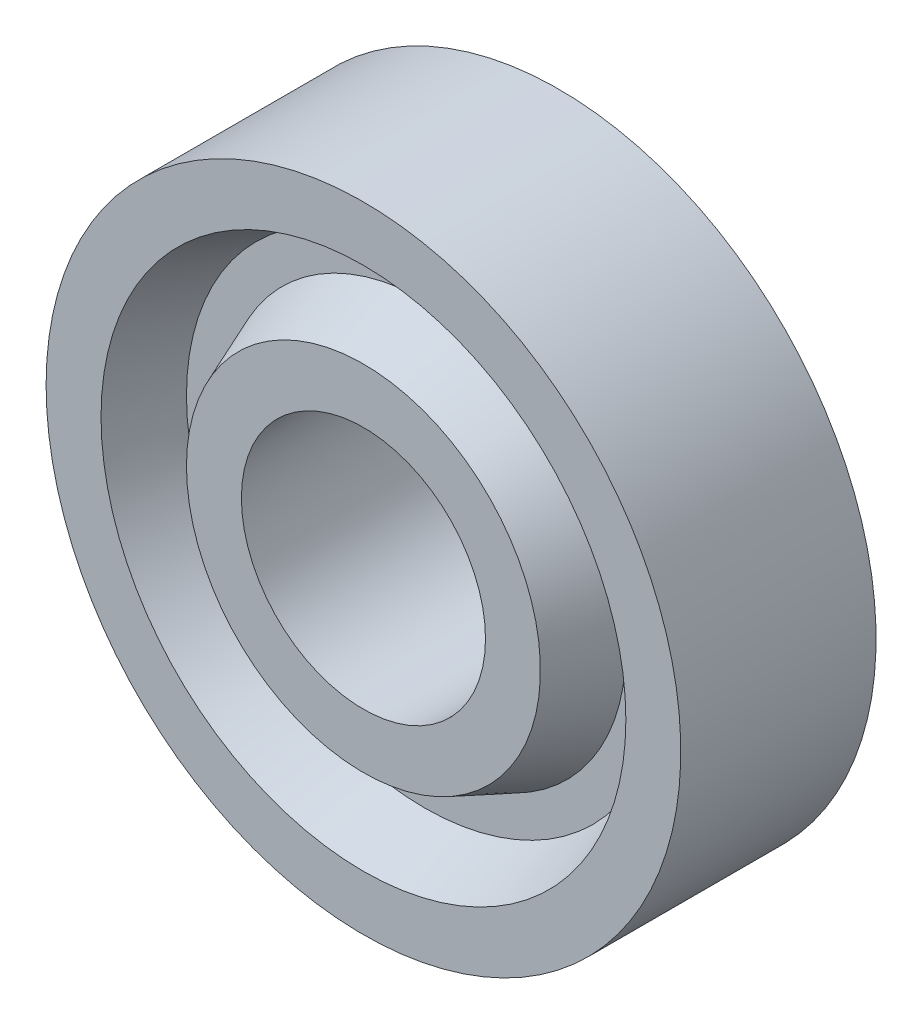
ISO-10303-21;
HEADER;
FILE_DESCRIPTION(('STEP AP214'),'2;1');
FILE_NAME('part.step','',(''),(''),'','','');
FILE_SCHEMA(('AUTOMOTIVE_DESIGN { 1 0 10303 214 1 1 1 1 }'));
ENDSEC;
DATA;
#1=APPLICATION_CONTEXT('core data for automotive mechanical design processes');
#2=APPLICATION_PROTOCOL_DEFINITION('international standard','automotive_design',2000,#1);
#3=PRODUCT_CONTEXT('',#1,'mechanical');
#4=PRODUCT('Part','Part','',(#3));
#5=PRODUCT_RELATED_PRODUCT_CATEGORY('part','',(#4));
#6=PRODUCT_DEFINITION_FORMATION('','',#4);
#7=PRODUCT_DEFINITION_CONTEXT('part definition',#1,'design');
#8=PRODUCT_DEFINITION('design','',#6,#7);
#9=PRODUCT_DEFINITION_SHAPE('','',#8);
#10=(LENGTH_UNIT() NAMED_UNIT(*) SI_UNIT(.MILLI.,.METRE.));
#11=(NAMED_UNIT(*) PLANE_ANGLE_UNIT() SI_UNIT($,.RADIAN.));
#12=(NAMED_UNIT(*) SI_UNIT($,.STERADIAN.) SOLID_ANGLE_UNIT());
#13=UNCERTAINTY_MEASURE_WITH_UNIT(LENGTH_MEASURE(1.E-05),#10,'distance_accuracy_value','');
#14=(GEOMETRIC_REPRESENTATION_CONTEXT(3) GLOBAL_UNCERTAINTY_ASSIGNED_CONTEXT((#13)) GLOBAL_UNIT_ASSIGNED_CONTEXT((#10,
#11,#12)) REPRESENTATION_CONTEXT('',''));
#15=CARTESIAN_POINT('',(0.,0.,0.));
#16=DIRECTION('',(0.,0.,1.));
#17=DIRECTION('',(1.,0.,0.));
#18=AXIS2_PLACEMENT_3D('',#15,#16,#17);
#19=CARTESIAN_POINT('',(5.,0.,-4.));
#20=DIRECTION('',(0.,0.,1.));
#21=DIRECTION('',(1.,0.,0.));
#22=AXIS2_PLACEMENT_3D('',#19,#20,#21);
#23=PLANE('',#22);
#24=CARTESIAN_POINT('',(0.,0.,-4.));
#25=DIRECTION('',(0.,0.,-1.));
#26=DIRECTION('',(-1.,0.,0.));
#27=AXIS2_PLACEMENT_3D('',#24,#25,#26);
#28=CIRCLE('',#27,5.);
#29=CARTESIAN_POINT('',(-4.99999999999999,0.,-4.));
#30=VERTEX_POINT('',#29);
#31=EDGE_CURVE('E73',#30,#30,#28,.T.);
#32=ORIENTED_EDGE('',*,*,#31,.F.);
#33=EDGE_LOOP('',(#32));
#34=FACE_BOUND('',#33,.T.);
#35=CARTESIAN_POINT('',(0.,0.,-4.));
#36=DIRECTION('',(0.,0.,-1.));
#37=DIRECTION('',(-1.,0.,0.));
#38=AXIS2_PLACEMENT_3D('',#35,#36,#37);
#39=CIRCLE('',#38,7.25);
#40=CARTESIAN_POINT('',(-7.24999999999999,0.,-4.));
#41=VERTEX_POINT('',#40);
#42=EDGE_CURVE('E10',#41,#41,#39,.T.);
#43=ORIENTED_EDGE('',*,*,#42,.T.);
#44=EDGE_LOOP('',(#43));
#45=FACE_BOUND('',#44,.T.);
#46=ADVANCED_FACE('F33',(#34,#45),#23,.F.);
#47=CARTESIAN_POINT('',(0.,0.,-1.5));
#48=DIRECTION('',(0.,0.,1.));
#49=DIRECTION('',(1.,0.,0.));
#50=AXIS2_PLACEMENT_3D('',#47,#48,#49);
#51=CONICAL_SURFACE('',#50,8.25,0.380506377112365);
#52=ORIENTED_EDGE('',*,*,#42,.F.);
#53=EDGE_LOOP('',(#52));
#54=FACE_BOUND('',#53,.T.);
#55=CARTESIAN_POINT('',(0.,0.,-1.5));
#56=DIRECTION('',(0.,0.,-1.));
#57=DIRECTION('',(-1.,0.,0.));
#58=AXIS2_PLACEMENT_3D('',#55,#56,#57);
#59=CIRCLE('',#58,8.25);
#60=CARTESIAN_POINT('',(-8.24999999999999,0.,-1.5));
#61=VERTEX_POINT('',#60);
#62=EDGE_CURVE('E39',#61,#61,#59,.T.);
#63=ORIENTED_EDGE('',*,*,#62,.T.);
#64=EDGE_LOOP('',(#63));
#65=FACE_BOUND('',#64,.T.);
#66=ADVANCED_FACE('F80',(#54,#65),#51,.T.);
#67=CARTESIAN_POINT('',(8.25,0.,-1.5));
#68=DIRECTION('',(0.,0.,1.));
#69=DIRECTION('',(1.,0.,0.));
#70=AXIS2_PLACEMENT_3D('',#67,#68,#69);
#71=PLANE('',#70);
#72=ORIENTED_EDGE('',*,*,#62,.F.);
#73=EDGE_LOOP('',(#72));
#74=FACE_BOUND('',#73,.T.);
#75=CARTESIAN_POINT('',(0.,0.,-1.5));
#76=DIRECTION('',(0.,0.,-1.));
#77=DIRECTION('',(-1.,0.,0.));
#78=AXIS2_PLACEMENT_3D('',#75,#76,#77);
#79=CIRCLE('',#78,9.75);
#80=CARTESIAN_POINT('',(-9.74999999999999,0.,-1.5));
#81=VERTEX_POINT('',#80);
#82=EDGE_CURVE('E43',#81,#81,#79,.T.);
#83=ORIENTED_EDGE('',*,*,#82,.T.);
#84=EDGE_LOOP('',(#83));
#85=FACE_BOUND('',#84,.T.);
#86=ADVANCED_FACE('F84',(#74,#85),#71,.F.);
#87=CARTESIAN_POINT('',(0.,0.,-4.));
#88=DIRECTION('',(0.,0.,-1.));
#89=DIRECTION('',(-1.,0.,0.));
#90=AXIS2_PLACEMENT_3D('',#87,#88,#89);
#91=CONICAL_SURFACE('',#90,10.75,0.380506377112365);
#92=ORIENTED_EDGE('',*,*,#82,.F.);
#93=EDGE_LOOP('',(#92));
#94=FACE_BOUND('',#93,.T.);
#95=CARTESIAN_POINT('',(0.,0.,-4.));
#96=DIRECTION('',(0.,0.,-1.));
#97=DIRECTION('',(-1.,0.,0.));
#98=AXIS2_PLACEMENT_3D('',#95,#96,#97);
#99=CIRCLE('',#98,10.75);
#100=CARTESIAN_POINT('',(-10.75,0.,-4.));
#101=VERTEX_POINT('',#100);
#102=EDGE_CURVE('E47',#101,#101,#99,.T.);
#103=ORIENTED_EDGE('',*,*,#102,.T.);
#104=EDGE_LOOP('',(#103));
#105=FACE_BOUND('',#104,.T.);
#106=ADVANCED_FACE('F89',(#94,#105),#91,.F.);
#107=CARTESIAN_POINT('',(10.75,0.,-4.));
#108=DIRECTION('',(0.,0.,1.));
#109=DIRECTION('',(1.,0.,0.));
#110=AXIS2_PLACEMENT_3D('',#107,#108,#109);
#111=PLANE('',#110);
#112=ORIENTED_EDGE('',*,*,#102,.F.);
#113=EDGE_LOOP('',(#112));
#114=FACE_BOUND('',#113,.T.);
#115=CARTESIAN_POINT('',(0.,0.,-4.));
#116=DIRECTION('',(0.,0.,-1.));
#117=DIRECTION('',(-1.,0.,0.));
#118=AXIS2_PLACEMENT_3D('',#115,#116,#117);
#119=CIRCLE('',#118,13.);
#120=CARTESIAN_POINT('',(-13.,0.,-3.99999999999999));
#121=VERTEX_POINT('',#120);
#122=EDGE_CURVE('E52',#121,#121,#119,.T.);
#123=ORIENTED_EDGE('',*,*,#122,.T.);
#124=EDGE_LOOP('',(#123));
#125=FACE_BOUND('',#124,.T.);
#126=ADVANCED_FACE('F95',(#114,#125),#111,.F.);
#127=CARTESIAN_POINT('',(0.,0.,-28.9111066531376));
#128=DIRECTION('',(0.,0.,-1.));
#129=DIRECTION('',(-1.,0.,0.));
#130=AXIS2_PLACEMENT_3D('',#127,#128,#129);
#131=CYLINDRICAL_SURFACE('',#130,13.);
#132=ORIENTED_EDGE('',*,*,#122,.F.);
#133=EDGE_LOOP('',(#132));
#134=FACE_BOUND('',#133,.T.);
#135=CARTESIAN_POINT('',(0.,0.,4.));
#136=DIRECTION('',(0.,0.,-1.));
#137=DIRECTION('',(-1.,0.,0.));
#138=AXIS2_PLACEMENT_3D('',#135,#136,#137);
#139=CIRCLE('',#138,13.);
#140=CARTESIAN_POINT('',(-13.,0.,4.00000000000001));
#141=VERTEX_POINT('',#140);
#142=EDGE_CURVE('E55',#141,#141,#139,.T.);
#143=ORIENTED_EDGE('',*,*,#142,.T.);
#144=EDGE_LOOP('',(#143));
#145=FACE_BOUND('',#144,.T.);
#146=ADVANCED_FACE('F99',(#134,#145),#131,.T.);
#147=CARTESIAN_POINT('',(10.75,0.,4.));
#148=DIRECTION('',(0.,0.,-1.));
#149=DIRECTION('',(-1.,0.,0.));
#150=AXIS2_PLACEMENT_3D('',#147,#148,#149);
#151=PLANE('',#150);
#152=ORIENTED_EDGE('',*,*,#142,.F.);
#153=EDGE_LOOP('',(#152));
#154=FACE_BOUND('',#153,.T.);
#155=CARTESIAN_POINT('',(0.,0.,4.));
#156=DIRECTION('',(0.,0.,-1.));
#157=DIRECTION('',(-1.,0.,0.));
#158=AXIS2_PLACEMENT_3D('',#155,#156,#157);
#159=CIRCLE('',#158,10.75);
#160=CARTESIAN_POINT('',(-10.75,0.,4.00000000000001));
#161=VERTEX_POINT('',#160);
#162=EDGE_CURVE('E58',#161,#161,#159,.T.);
#163=ORIENTED_EDGE('',*,*,#162,.T.);
#164=EDGE_LOOP('',(#163));
#165=FACE_BOUND('',#164,.T.);
#166=ADVANCED_FACE('F103',(#154,#165),#151,.F.);
#167=CARTESIAN_POINT('',(0.,0.,1.5));
#168=DIRECTION('',(0.,0.,1.));
#169=DIRECTION('',(1.,0.,0.));
#170=AXIS2_PLACEMENT_3D('',#167,#168,#169);
#171=CONICAL_SURFACE('',#170,9.75,0.380506377112364);
#172=ORIENTED_EDGE('',*,*,#162,.F.);
#173=EDGE_LOOP('',(#172));
#174=FACE_BOUND('',#173,.T.);
#175=CARTESIAN_POINT('',(0.,0.,1.5));
#176=DIRECTION('',(0.,0.,-1.));
#177=DIRECTION('',(-1.,0.,0.));
#178=AXIS2_PLACEMENT_3D('',#175,#176,#177);
#179=CIRCLE('',#178,9.75);
#180=CARTESIAN_POINT('',(-9.74999999999999,0.,1.5));
#181=VERTEX_POINT('',#180);
#182=EDGE_CURVE('E61',#181,#181,#179,.T.);
#183=ORIENTED_EDGE('',*,*,#182,.T.);
#184=EDGE_LOOP('',(#183));
#185=FACE_BOUND('',#184,.T.);
#186=ADVANCED_FACE('F107',(#174,#185),#171,.F.);
#187=CARTESIAN_POINT('',(9.75,0.,1.5));
#188=DIRECTION('',(0.,0.,-1.));
#189=DIRECTION('',(-1.,0.,0.));
#190=AXIS2_PLACEMENT_3D('',#187,#188,#189);
#191=PLANE('',#190);
#192=ORIENTED_EDGE('',*,*,#182,.F.);
#193=EDGE_LOOP('',(#192));
#194=FACE_BOUND('',#193,.T.);
#195=CARTESIAN_POINT('',(0.,0.,1.5));
#196=DIRECTION('',(0.,0.,-1.));
#197=DIRECTION('',(-1.,0.,0.));
#198=AXIS2_PLACEMENT_3D('',#195,#196,#197);
#199=CIRCLE('',#198,8.25);
#200=CARTESIAN_POINT('',(-8.24999999999999,0.,1.5));
#201=VERTEX_POINT('',#200);
#202=EDGE_CURVE('E64',#201,#201,#199,.T.);
#203=ORIENTED_EDGE('',*,*,#202,.T.);
#204=EDGE_LOOP('',(#203));
#205=FACE_BOUND('',#204,.T.);
#206=ADVANCED_FACE('F111',(#194,#205),#191,.F.);
#207=CARTESIAN_POINT('',(0.,0.,4.));
#208=DIRECTION('',(0.,0.,-1.));
#209=DIRECTION('',(-1.,0.,0.));
#210=AXIS2_PLACEMENT_3D('',#207,#208,#209);
#211=CONICAL_SURFACE('',#210,7.25,0.380506377112365);
#212=ORIENTED_EDGE('',*,*,#202,.F.);
#213=EDGE_LOOP('',(#212));
#214=FACE_BOUND('',#213,.T.);
#215=CARTESIAN_POINT('',(0.,0.,4.));
#216=DIRECTION('',(0.,0.,-1.));
#217=DIRECTION('',(-1.,0.,0.));
#218=AXIS2_PLACEMENT_3D('',#215,#216,#217);
#219=CIRCLE('',#218,7.25);
#220=CARTESIAN_POINT('',(-7.24999999999999,0.,4.));
#221=VERTEX_POINT('',#220);
#222=EDGE_CURVE('E67',#221,#221,#219,.T.);
#223=ORIENTED_EDGE('',*,*,#222,.T.);
#224=EDGE_LOOP('',(#223));
#225=FACE_BOUND('',#224,.T.);
#226=ADVANCED_FACE('F115',(#214,#225),#211,.T.);
#227=CARTESIAN_POINT('',(5.,0.,4.));
#228=DIRECTION('',(0.,0.,-1.));
#229=DIRECTION('',(-1.,0.,0.));
#230=AXIS2_PLACEMENT_3D('',#227,#228,#229);
#231=PLANE('',#230);
#232=ORIENTED_EDGE('',*,*,#222,.F.);
#233=EDGE_LOOP('',(#232));
#234=FACE_BOUND('',#233,.T.);
#235=CARTESIAN_POINT('',(0.,0.,4.));
#236=DIRECTION('',(0.,0.,-1.));
#237=DIRECTION('',(-1.,0.,0.));
#238=AXIS2_PLACEMENT_3D('',#235,#236,#237);
#239=CIRCLE('',#238,5.);
#240=CARTESIAN_POINT('',(-4.99999999999999,0.,4.));
#241=VERTEX_POINT('',#240);
#242=EDGE_CURVE('E70',#241,#241,#239,.T.);
#243=ORIENTED_EDGE('',*,*,#242,.T.);
#244=EDGE_LOOP('',(#243));
#245=FACE_BOUND('',#244,.T.);
#246=ADVANCED_FACE('F119',(#234,#245),#231,.F.);
#247=CARTESIAN_POINT('',(0.,0.,-28.9111066531376));
#248=DIRECTION('',(0.,0.,-1.));
#249=DIRECTION('',(-1.,0.,0.));
#250=AXIS2_PLACEMENT_3D('',#247,#248,#249);
#251=CYLINDRICAL_SURFACE('',#250,5.);
#252=ORIENTED_EDGE('',*,*,#242,.F.);
#253=EDGE_LOOP('',(#252));
#254=FACE_BOUND('',#253,.T.);
#255=ORIENTED_EDGE('',*,*,#31,.T.);
#256=EDGE_LOOP('',(#255));
#257=FACE_BOUND('',#256,.T.);
#258=ADVANCED_FACE('F77',(#254,#257),#251,.F.);
#259=CLOSED_SHELL('',(#46,#66,#86,#106,#126,#146,#166,#186,#206,#226,#246,#258));
#260=MANIFOLD_SOLID_BREP('B2',#259);
#261=ADVANCED_BREP_SHAPE_REPRESENTATION('',(#18,#260),#14);
#262=SHAPE_DEFINITION_REPRESENTATION(#9,#261);
ENDSEC;
END-ISO-10303-21;
